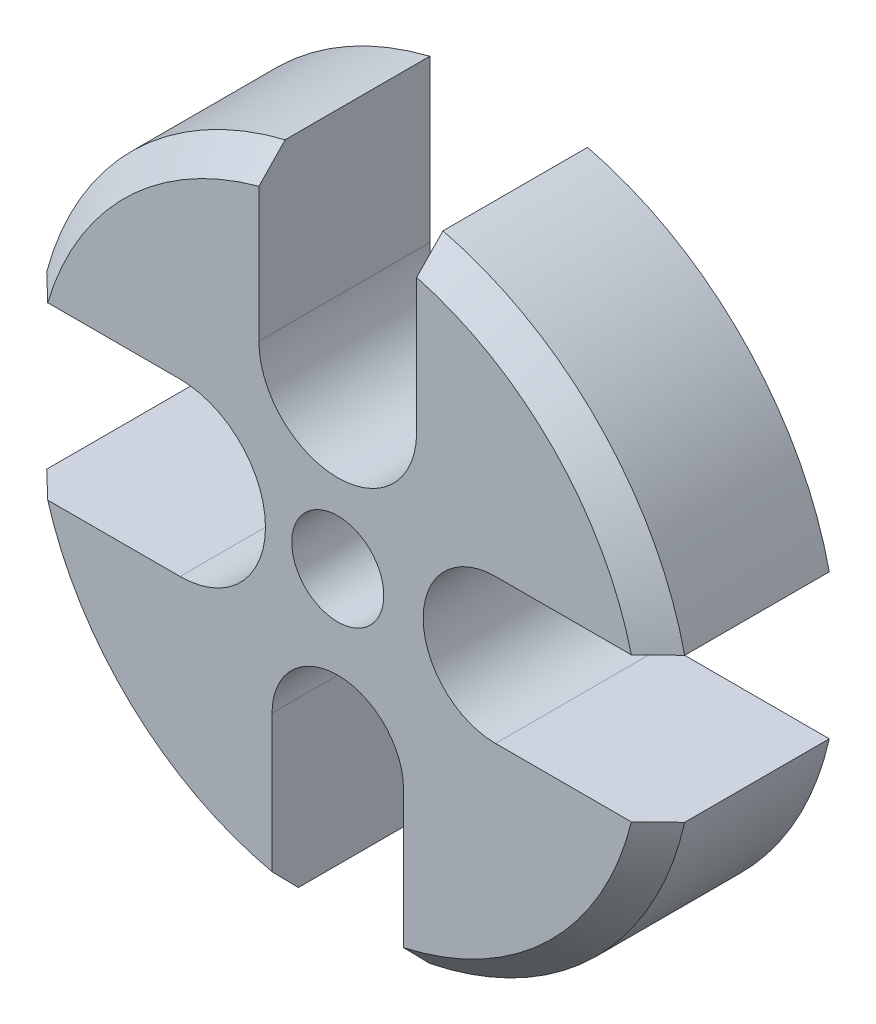
ISO-10303-21;
HEADER;
FILE_DESCRIPTION(('STEP AP214'),'2;1');
FILE_NAME('part.step','',(''),(''),'','','');
FILE_SCHEMA(('AUTOMOTIVE_DESIGN { 1 0 10303 214 1 1 1 1 }'));
ENDSEC;
DATA;
#1=APPLICATION_CONTEXT('core data for automotive mechanical design processes');
#2=APPLICATION_PROTOCOL_DEFINITION('international standard','automotive_design',2000,#1);
#3=PRODUCT_CONTEXT('',#1,'mechanical');
#4=PRODUCT('Part','Part','',(#3));
#5=PRODUCT_RELATED_PRODUCT_CATEGORY('part','',(#4));
#6=PRODUCT_DEFINITION_FORMATION('','',#4);
#7=PRODUCT_DEFINITION_CONTEXT('part definition',#1,'design');
#8=PRODUCT_DEFINITION('design','',#6,#7);
#9=PRODUCT_DEFINITION_SHAPE('','',#8);
#10=(LENGTH_UNIT() NAMED_UNIT(*) SI_UNIT(.MILLI.,.METRE.));
#11=(NAMED_UNIT(*) PLANE_ANGLE_UNIT() SI_UNIT($,.RADIAN.));
#12=(NAMED_UNIT(*) SI_UNIT($,.STERADIAN.) SOLID_ANGLE_UNIT());
#13=UNCERTAINTY_MEASURE_WITH_UNIT(LENGTH_MEASURE(1.E-05),#10,'distance_accuracy_value','');
#14=(GEOMETRIC_REPRESENTATION_CONTEXT(3) GLOBAL_UNCERTAINTY_ASSIGNED_CONTEXT((#13)) GLOBAL_UNIT_ASSIGNED_CONTEXT((#10,
#11,#12)) REPRESENTATION_CONTEXT('',''));
#15=CARTESIAN_POINT('',(0.,0.,0.));
#16=DIRECTION('',(0.,0.,1.));
#17=DIRECTION('',(1.,0.,0.));
#18=AXIS2_PLACEMENT_3D('',#15,#16,#17);
#19=CARTESIAN_POINT('',(5.,0.,13.));
#20=DIRECTION('',(1.,0.,0.));
#21=DIRECTION('',(0.,0.,-1.));
#22=AXIS2_PLACEMENT_3D('',#19,#20,#21);
#23=PLANE('',#22);
#24=DIRECTION('',(0.,0.,-1.));
#25=VECTOR('',#24,1.);
#26=CARTESIAN_POINT('',(5.,-24.4948974278318,13.));
#27=LINE('',#26,#25);
#28=CARTESIAN_POINT('',(5.,-24.4948974278318,11.));
#29=VERTEX_POINT('',#28);
#30=CARTESIAN_POINT('',(5.,-24.4948974278318,0.));
#31=VERTEX_POINT('',#30);
#32=EDGE_CURVE('E313',#29,#31,#27,.T.);
#33=ORIENTED_EDGE('',*,*,#32,.F.);
#34=CARTESIAN_POINT('',(5.,-24.4948974278318,11.));
#35=CARTESIAN_POINT('',(5.,-24.1543875179738,11.3336560287532));
#36=CARTESIAN_POINT('',(5.,-23.8137198057054,11.6671507082415));
#37=CARTESIAN_POINT('',(5.,-23.1320687699819,12.3338173749142));
#38=CARTESIAN_POINT('',(5.,-22.791085446521,12.6669893620925));
#39=CARTESIAN_POINT('',(5.,-22.4499443206437,13.));
#40=B_SPLINE_CURVE_WITH_KNOTS('',3,(#34,#35,#36,#37,#38,#39),.UNSPECIFIED.,.F.,.F.,(4,2,4),(0.,
1.43019534430208,2.86039071531582),.UNSPECIFIED.);
#41=CARTESIAN_POINT('',(5.,-22.4499443206437,13.));
#42=VERTEX_POINT('',#41);
#43=EDGE_CURVE('E420',#29,#42,#40,.T.);
#44=ORIENTED_EDGE('',*,*,#43,.T.);
#45=DIRECTION('',(0.,-1.,0.));
#46=VECTOR('',#45,1.);
#47=CARTESIAN_POINT('',(5.,0.,13.));
#48=LINE('',#47,#46);
#49=CARTESIAN_POINT('',(5.,-12.,13.));
#50=VERTEX_POINT('',#49);
#51=EDGE_CURVE('E194',#50,#42,#48,.T.);
#52=ORIENTED_EDGE('',*,*,#51,.F.);
#53=DIRECTION('',(0.,0.,-1.));
#54=VECTOR('',#53,1.);
#55=CARTESIAN_POINT('',(5.,-12.,13.));
#56=LINE('',#55,#54);
#57=CARTESIAN_POINT('',(5.,-12.,0.));
#58=VERTEX_POINT('',#57);
#59=EDGE_CURVE('E237',#50,#58,#56,.T.);
#60=ORIENTED_EDGE('',*,*,#59,.T.);
#61=DIRECTION('',(0.,-1.,0.));
#62=VECTOR('',#61,1.);
#63=CARTESIAN_POINT('',(5.,0.,0.));
#64=LINE('',#63,#62);
#65=EDGE_CURVE('E238',#58,#31,#64,.T.);
#66=ORIENTED_EDGE('',*,*,#65,.T.);
#67=EDGE_LOOP('',(#33,#44,#52,#60,#66));
#68=FACE_BOUND('',#67,.T.);
#69=ADVANCED_FACE('F41',(#68),#23,.F.);
#70=CARTESIAN_POINT('',(0.,0.,13.));
#71=DIRECTION('',(0.,0.,-1.));
#72=DIRECTION('',(-1.,0.,0.));
#73=AXIS2_PLACEMENT_3D('',#70,#71,#72);
#74=CYLINDRICAL_SURFACE('',#73,25.);
#75=DIRECTION('',(0.,0.,-1.));
#76=VECTOR('',#75,1.);
#77=CARTESIAN_POINT('',(24.3874967965144,-5.5,13.));
#78=LINE('',#77,#76);
#79=CARTESIAN_POINT('',(24.3874967965144,-5.5,11.));
#80=VERTEX_POINT('',#79);
#81=CARTESIAN_POINT('',(24.3874967965144,-5.5,0.));
#82=VERTEX_POINT('',#81);
#83=EDGE_CURVE('E202',#80,#82,#78,.T.);
#84=ORIENTED_EDGE('',*,*,#83,.F.);
#85=CARTESIAN_POINT('',(0.,0.,11.));
#86=DIRECTION('',(0.,0.,1.));
#87=DIRECTION('',(1.,0.,0.));
#88=AXIS2_PLACEMENT_3D('',#85,#86,#87);
#89=CIRCLE('',#88,25.);
#90=EDGE_CURVE('E403',#80,#29,#89,.F.);
#91=ORIENTED_EDGE('',*,*,#90,.T.);
#92=ORIENTED_EDGE('',*,*,#32,.T.);
#93=CARTESIAN_POINT('',(0.,0.,0.));
#94=DIRECTION('',(0.,0.,1.));
#95=DIRECTION('',(1.,0.,0.));
#96=AXIS2_PLACEMENT_3D('',#93,#94,#95);
#97=CIRCLE('',#96,25.);
#98=EDGE_CURVE('E245',#31,#82,#97,.T.);
#99=ORIENTED_EDGE('',*,*,#98,.T.);
#100=EDGE_LOOP('',(#84,#91,#92,#99));
#101=FACE_BOUND('',#100,.T.);
#102=ADVANCED_FACE('F413',(#101),#74,.T.);
#103=CARTESIAN_POINT('',(0.,-5.5,13.));
#104=DIRECTION('',(0.,-1.,0.));
#105=DIRECTION('',(0.,0.,-1.));
#106=AXIS2_PLACEMENT_3D('',#103,#104,#105);
#107=PLANE('',#106);
#108=DIRECTION('',(-1.,0.,0.));
#109=VECTOR('',#108,1.);
#110=CARTESIAN_POINT('',(0.,-5.5,13.));
#111=LINE('',#110,#109);
#112=CARTESIAN_POINT('',(22.3327114341273,-5.5,13.));
#113=VERTEX_POINT('',#112);
#114=CARTESIAN_POINT('',(12.,-5.5,13.));
#115=VERTEX_POINT('',#114);
#116=EDGE_CURVE('E184',#113,#115,#111,.T.);
#117=ORIENTED_EDGE('',*,*,#116,.F.);
#118=CARTESIAN_POINT('',(22.3327114341273,-5.5,13.));
#119=CARTESIAN_POINT('',(22.6755611901675,-5.5,12.6670627467669));
#120=CARTESIAN_POINT('',(23.0182181841032,-5.5,12.3339274511585));
#121=CARTESIAN_POINT('',(23.7031466382215,-5.5,11.6672607844808));
#122=CARTESIAN_POINT('',(24.0454180984148,-5.5,11.3337294134226));
#123=CARTESIAN_POINT('',(24.3874967965144,-5.5,11.));
#124=B_SPLINE_CURVE_WITH_KNOTS('',3,(#118,#119,#120,#121,#122,#123),.UNSPECIFIED.,.F.,.F.,(4,2,
4),(0.,1.43371422049806,2.86742840103957),.UNSPECIFIED.);
#125=EDGE_CURVE('E398',#113,#80,#124,.T.);
#126=ORIENTED_EDGE('',*,*,#125,.T.);
#127=ORIENTED_EDGE('',*,*,#83,.T.);
#128=DIRECTION('',(-1.,0.,0.));
#129=VECTOR('',#128,1.);
#130=CARTESIAN_POINT('',(0.,-5.5,0.));
#131=LINE('',#130,#129);
#132=CARTESIAN_POINT('',(12.,-5.5,0.));
#133=VERTEX_POINT('',#132);
#134=EDGE_CURVE('E203',#82,#133,#131,.T.);
#135=ORIENTED_EDGE('',*,*,#134,.T.);
#136=DIRECTION('',(0.,0.,-1.));
#137=VECTOR('',#136,1.);
#138=CARTESIAN_POINT('',(12.,-5.5,13.));
#139=LINE('',#138,#137);
#140=EDGE_CURVE('E196',#115,#133,#139,.T.);
#141=ORIENTED_EDGE('',*,*,#140,.F.);
#142=EDGE_LOOP('',(#117,#126,#127,#135,#141));
#143=FACE_BOUND('',#142,.T.);
#144=ADVANCED_FACE('F200',(#143),#107,.F.);
#145=CARTESIAN_POINT('',(12.,0.,13.));
#146=DIRECTION('',(0.,0.,-1.));
#147=DIRECTION('',(-1.,0.,0.));
#148=AXIS2_PLACEMENT_3D('',#145,#146,#147);
#149=CYLINDRICAL_SURFACE('',#148,5.5);
#150=CARTESIAN_POINT('',(12.,0.,0.));
#151=DIRECTION('',(0.,0.,1.));
#152=DIRECTION('',(1.,0.,0.));
#153=AXIS2_PLACEMENT_3D('',#150,#151,#152);
#154=CIRCLE('',#153,5.5);
#155=CARTESIAN_POINT('',(12.,5.5,0.));
#156=VERTEX_POINT('',#155);
#157=EDGE_CURVE('E250',#156,#133,#154,.T.);
#158=ORIENTED_EDGE('',*,*,#157,.F.);
#159=DIRECTION('',(0.,0.,-1.));
#160=VECTOR('',#159,1.);
#161=CARTESIAN_POINT('',(12.,5.5,13.));
#162=LINE('',#161,#160);
#163=CARTESIAN_POINT('',(12.,5.5,13.));
#164=VERTEX_POINT('',#163);
#165=EDGE_CURVE('E206',#164,#156,#162,.T.);
#166=ORIENTED_EDGE('',*,*,#165,.F.);
#167=CARTESIAN_POINT('',(12.,0.,13.));
#168=DIRECTION('',(0.,0.,1.));
#169=DIRECTION('',(1.,0.,0.));
#170=AXIS2_PLACEMENT_3D('',#167,#168,#169);
#171=CIRCLE('',#170,5.5);
#172=EDGE_CURVE('E187',#164,#115,#171,.T.);
#173=ORIENTED_EDGE('',*,*,#172,.T.);
#174=ORIENTED_EDGE('',*,*,#140,.T.);
#175=EDGE_LOOP('',(#158,#166,#173,#174));
#176=FACE_BOUND('',#175,.T.);
#177=ADVANCED_FACE('F207',(#176),#149,.F.);
#178=CARTESIAN_POINT('',(0.,5.5,13.));
#179=DIRECTION('',(0.,-1.,0.));
#180=DIRECTION('',(0.,0.,-1.));
#181=AXIS2_PLACEMENT_3D('',#178,#179,#180);
#182=PLANE('',#181);
#183=DIRECTION('',(0.,0.,-1.));
#184=VECTOR('',#183,1.);
#185=CARTESIAN_POINT('',(24.3874967965144,5.5,13.));
#186=LINE('',#185,#184);
#187=CARTESIAN_POINT('',(24.3874967965144,5.5,11.));
#188=VERTEX_POINT('',#187);
#189=CARTESIAN_POINT('',(24.3874967965144,5.5,0.));
#190=VERTEX_POINT('',#189);
#191=EDGE_CURVE('E307',#188,#190,#186,.T.);
#192=ORIENTED_EDGE('',*,*,#191,.F.);
#193=CARTESIAN_POINT('',(24.3874967965144,5.5,11.));
#194=CARTESIAN_POINT('',(24.0454180984148,5.5,11.3337294134226));
#195=CARTESIAN_POINT('',(23.7031466382214,5.5,11.6672607844808));
#196=CARTESIAN_POINT('',(23.0182181841032,5.5,12.3339274511585));
#197=CARTESIAN_POINT('',(22.6755611901675,5.5,12.6670627467669));
#198=CARTESIAN_POINT('',(22.3327114341273,5.5,13.));
#199=B_SPLINE_CURVE_WITH_KNOTS('',3,(#193,#194,#195,#196,#197,#198),.UNSPECIFIED.,.F.,.F.,(4,2,
4),(0.,1.43371418054151,2.86742840103957),.UNSPECIFIED.);
#200=CARTESIAN_POINT('',(22.3327114341273,5.5,13.));
#201=VERTEX_POINT('',#200);
#202=EDGE_CURVE('E391',#188,#201,#199,.T.);
#203=ORIENTED_EDGE('',*,*,#202,.T.);
#204=DIRECTION('',(-1.,0.,0.));
#205=VECTOR('',#204,1.);
#206=CARTESIAN_POINT('',(0.,5.5,13.));
#207=LINE('',#206,#205);
#208=EDGE_CURVE('E209',#201,#164,#207,.T.);
#209=ORIENTED_EDGE('',*,*,#208,.T.);
#210=ORIENTED_EDGE('',*,*,#165,.T.);
#211=DIRECTION('',(-1.,0.,0.));
#212=VECTOR('',#211,1.);
#213=CARTESIAN_POINT('',(0.,5.5,0.));
#214=LINE('',#213,#212);
#215=EDGE_CURVE('E247',#190,#156,#214,.T.);
#216=ORIENTED_EDGE('',*,*,#215,.F.);
#217=EDGE_LOOP('',(#192,#203,#209,#210,#216));
#218=FACE_BOUND('',#217,.T.);
#219=ADVANCED_FACE('F383',(#218),#182,.T.);
#220=CARTESIAN_POINT('',(0.,0.,13.));
#221=DIRECTION('',(0.,0.,-1.));
#222=DIRECTION('',(-1.,0.,0.));
#223=AXIS2_PLACEMENT_3D('',#220,#221,#222);
#224=CYLINDRICAL_SURFACE('',#223,25.);
#225=DIRECTION('',(0.,0.,-1.));
#226=VECTOR('',#225,1.);
#227=CARTESIAN_POINT('',(6.,24.2693221990232,13.));
#228=LINE('',#227,#226);
#229=CARTESIAN_POINT('',(6.,24.2693221990232,11.));
#230=VERTEX_POINT('',#229);
#231=CARTESIAN_POINT('',(6.,24.2693221990232,0.));
#232=VERTEX_POINT('',#231);
#233=EDGE_CURVE('E304',#230,#232,#228,.T.);
#234=ORIENTED_EDGE('',*,*,#233,.F.);
#235=CARTESIAN_POINT('',(0.,0.,11.));
#236=DIRECTION('',(0.,0.,1.));
#237=DIRECTION('',(1.,0.,0.));
#238=AXIS2_PLACEMENT_3D('',#235,#236,#237);
#239=CIRCLE('',#238,25.);
#240=EDGE_CURVE('E397',#230,#188,#239,.F.);
#241=ORIENTED_EDGE('',*,*,#240,.T.);
#242=ORIENTED_EDGE('',*,*,#191,.T.);
#243=CARTESIAN_POINT('',(0.,0.,0.));
#244=DIRECTION('',(0.,0.,1.));
#245=DIRECTION('',(1.,0.,0.));
#246=AXIS2_PLACEMENT_3D('',#243,#244,#245);
#247=CIRCLE('',#246,25.);
#248=EDGE_CURVE('E252',#190,#232,#247,.T.);
#249=ORIENTED_EDGE('',*,*,#248,.T.);
#250=EDGE_LOOP('',(#234,#241,#242,#249));
#251=FACE_BOUND('',#250,.T.);
#252=ADVANCED_FACE('F379',(#251),#224,.T.);
#253=CARTESIAN_POINT('',(6.,0.,13.));
#254=DIRECTION('',(1.,0.,0.));
#255=DIRECTION('',(0.,0.,-1.));
#256=AXIS2_PLACEMENT_3D('',#253,#254,#255);
#257=PLANE('',#256);
#258=DIRECTION('',(0.,-1.,0.));
#259=VECTOR('',#258,1.);
#260=CARTESIAN_POINT('',(6.,0.,13.));
#261=LINE('',#260,#259);
#262=CARTESIAN_POINT('',(6.,22.2036033111745,13.));
#263=VERTEX_POINT('',#262);
#264=CARTESIAN_POINT('',(6.,12.,13.));
#265=VERTEX_POINT('',#264);
#266=EDGE_CURVE('E215',#263,#265,#261,.T.);
#267=ORIENTED_EDGE('',*,*,#266,.F.);
#268=CARTESIAN_POINT('',(6.,22.2036033111745,13.));
#269=CARTESIAN_POINT('',(6.,22.5483534369044,12.6671455323017));
#270=CARTESIAN_POINT('',(6.,22.892871743888,12.3340516284222));
#271=CARTESIAN_POINT('',(6.,23.5814447064855,11.6673849617362));
#272=CARTESIAN_POINT('',(6.,23.9254993621181,11.3338121989491));
#273=CARTESIAN_POINT('',(6.,24.2693221990232,11.));
#274=B_SPLINE_CURVE_WITH_KNOTS('',3,(#268,#269,#270,#271,#272,#273),.UNSPECIFIED.,.F.,.F.,(4,2,
4),(0.,1.43763685047273,2.87527364299825),.UNSPECIFIED.);
#275=EDGE_CURVE('E359',#263,#230,#274,.T.);
#276=ORIENTED_EDGE('',*,*,#275,.T.);
#277=ORIENTED_EDGE('',*,*,#233,.T.);
#278=DIRECTION('',(0.,-1.,0.));
#279=VECTOR('',#278,1.);
#280=CARTESIAN_POINT('',(6.,0.,0.));
#281=LINE('',#280,#279);
#282=CARTESIAN_POINT('',(6.,12.,0.));
#283=VERTEX_POINT('',#282);
#284=EDGE_CURVE('E254',#232,#283,#281,.T.);
#285=ORIENTED_EDGE('',*,*,#284,.T.);
#286=DIRECTION('',(0.,0.,-1.));
#287=VECTOR('',#286,1.);
#288=CARTESIAN_POINT('',(6.,12.,13.));
#289=LINE('',#288,#287);
#290=EDGE_CURVE('E303',#265,#283,#289,.T.);
#291=ORIENTED_EDGE('',*,*,#290,.F.);
#292=EDGE_LOOP('',(#267,#276,#277,#285,#291));
#293=FACE_BOUND('',#292,.T.);
#294=ADVANCED_FACE('F374',(#293),#257,.F.);
#295=CARTESIAN_POINT('',(0.,12.,13.));
#296=DIRECTION('',(0.,0.,-1.));
#297=DIRECTION('',(-1.,0.,0.));
#298=AXIS2_PLACEMENT_3D('',#295,#296,#297);
#299=CYLINDRICAL_SURFACE('',#298,6.);
#300=CARTESIAN_POINT('',(0.,12.,0.));
#301=DIRECTION('',(0.,0.,1.));
#302=DIRECTION('',(1.,0.,0.));
#303=AXIS2_PLACEMENT_3D('',#300,#301,#302);
#304=CIRCLE('',#303,6.);
#305=CARTESIAN_POINT('',(-6.,12.,0.));
#306=VERTEX_POINT('',#305);
#307=EDGE_CURVE('E256',#306,#283,#304,.T.);
#308=ORIENTED_EDGE('',*,*,#307,.F.);
#309=DIRECTION('',(0.,0.,-1.));
#310=VECTOR('',#309,1.);
#311=CARTESIAN_POINT('',(-6.,12.,13.));
#312=LINE('',#311,#310);
#313=CARTESIAN_POINT('',(-6.,12.,13.));
#314=VERTEX_POINT('',#313);
#315=EDGE_CURVE('E301',#314,#306,#312,.T.);
#316=ORIENTED_EDGE('',*,*,#315,.F.);
#317=CARTESIAN_POINT('',(0.,12.,13.));
#318=DIRECTION('',(0.,0.,1.));
#319=DIRECTION('',(1.,0.,0.));
#320=AXIS2_PLACEMENT_3D('',#317,#318,#319);
#321=CIRCLE('',#320,6.);
#322=EDGE_CURVE('E220',#314,#265,#321,.T.);
#323=ORIENTED_EDGE('',*,*,#322,.T.);
#324=ORIENTED_EDGE('',*,*,#290,.T.);
#325=EDGE_LOOP('',(#308,#316,#323,#324));
#326=FACE_BOUND('',#325,.T.);
#327=ADVANCED_FACE('F375',(#326),#299,.F.);
#328=CARTESIAN_POINT('',(-6.,0.,13.));
#329=DIRECTION('',(1.,0.,0.));
#330=DIRECTION('',(0.,0.,-1.));
#331=AXIS2_PLACEMENT_3D('',#328,#329,#330);
#332=PLANE('',#331);
#333=DIRECTION('',(0.,0.,-1.));
#334=VECTOR('',#333,1.);
#335=CARTESIAN_POINT('',(-6.,24.2693221990232,13.));
#336=LINE('',#335,#334);
#337=CARTESIAN_POINT('',(-6.,24.2693221990232,11.));
#338=VERTEX_POINT('',#337);
#339=CARTESIAN_POINT('',(-6.,24.2693221990232,0.));
#340=VERTEX_POINT('',#339);
#341=EDGE_CURVE('E298',#338,#340,#336,.T.);
#342=ORIENTED_EDGE('',*,*,#341,.F.);
#343=CARTESIAN_POINT('',(-6.,24.2693221990232,11.));
#344=CARTESIAN_POINT('',(-6.,23.9254993621181,11.3338121989491));
#345=CARTESIAN_POINT('',(-6.,23.5814447064855,11.6673849617362));
#346=CARTESIAN_POINT('',(-6.,22.892871743888,12.3340516284222));
#347=CARTESIAN_POINT('',(-6.,22.5483534369044,12.6671455323017));
#348=CARTESIAN_POINT('',(-6.,22.2036033111746,13.));
#349=B_SPLINE_CURVE_WITH_KNOTS('',3,(#343,#344,#345,#346,#347,#348),.UNSPECIFIED.,.F.,.F.,(4,2,
4),(0.,1.43763679252552,2.87527364299824),.UNSPECIFIED.);
#350=CARTESIAN_POINT('',(-6.,22.2036033111746,13.));
#351=VERTEX_POINT('',#350);
#352=EDGE_CURVE('E355',#338,#351,#349,.T.);
#353=ORIENTED_EDGE('',*,*,#352,.T.);
#354=DIRECTION('',(0.,-1.,0.));
#355=VECTOR('',#354,1.);
#356=CARTESIAN_POINT('',(-6.,0.,13.));
#357=LINE('',#356,#355);
#358=EDGE_CURVE('E219',#351,#314,#357,.T.);
#359=ORIENTED_EDGE('',*,*,#358,.T.);
#360=ORIENTED_EDGE('',*,*,#315,.T.);
#361=DIRECTION('',(0.,-1.,0.));
#362=VECTOR('',#361,1.);
#363=CARTESIAN_POINT('',(-6.,0.,0.));
#364=LINE('',#363,#362);
#365=EDGE_CURVE('E261',#340,#306,#364,.T.);
#366=ORIENTED_EDGE('',*,*,#365,.F.);
#367=EDGE_LOOP('',(#342,#353,#359,#360,#366));
#368=FACE_BOUND('',#367,.T.);
#369=ADVANCED_FACE('F370',(#368),#332,.T.);
#370=CARTESIAN_POINT('',(0.,0.,13.));
#371=DIRECTION('',(0.,0.,-1.));
#372=DIRECTION('',(-1.,0.,0.));
#373=AXIS2_PLACEMENT_3D('',#370,#371,#372);
#374=CYLINDRICAL_SURFACE('',#373,25.);
#375=DIRECTION('',(0.,0.,-1.));
#376=VECTOR('',#375,1.);
#377=CARTESIAN_POINT('',(-24.1402154091466,6.5,13.));
#378=LINE('',#377,#376);
#379=CARTESIAN_POINT('',(-24.1402154091466,6.5,11.));
#380=VERTEX_POINT('',#379);
#381=CARTESIAN_POINT('',(-24.1402154091466,6.5,0.));
#382=VERTEX_POINT('',#381);
#383=EDGE_CURVE('E296',#380,#382,#378,.T.);
#384=ORIENTED_EDGE('',*,*,#383,.F.);
#385=CARTESIAN_POINT('',(0.,0.,11.));
#386=DIRECTION('',(0.,0.,1.));
#387=DIRECTION('',(1.,0.,0.));
#388=AXIS2_PLACEMENT_3D('',#385,#386,#387);
#389=CIRCLE('',#388,25.);
#390=EDGE_CURVE('E332',#380,#338,#389,.F.);
#391=ORIENTED_EDGE('',*,*,#390,.T.);
#392=ORIENTED_EDGE('',*,*,#341,.T.);
#393=CARTESIAN_POINT('',(0.,0.,0.));
#394=DIRECTION('',(0.,0.,1.));
#395=DIRECTION('',(1.,0.,0.));
#396=AXIS2_PLACEMENT_3D('',#393,#394,#395);
#397=CIRCLE('',#396,25.);
#398=EDGE_CURVE('E262',#340,#382,#397,.T.);
#399=ORIENTED_EDGE('',*,*,#398,.T.);
#400=EDGE_LOOP('',(#384,#391,#392,#399));
#401=FACE_BOUND('',#400,.T.);
#402=ADVANCED_FACE('F371',(#401),#374,.T.);
#403=CARTESIAN_POINT('',(0.,6.5,13.));
#404=DIRECTION('',(0.,-1.,0.));
#405=DIRECTION('',(0.,0.,-1.));
#406=AXIS2_PLACEMENT_3D('',#403,#404,#405);
#407=PLANE('',#406);
#408=DIRECTION('',(-1.,0.,0.));
#409=VECTOR('',#408,1.);
#410=CARTESIAN_POINT('',(0.,6.5,13.));
#411=LINE('',#410,#409);
#412=CARTESIAN_POINT('',(-12.,6.5,13.));
#413=VERTEX_POINT('',#412);
#414=CARTESIAN_POINT('',(-22.0624114729102,6.5,13.));
#415=VERTEX_POINT('',#414);
#416=EDGE_CURVE('E225',#413,#415,#411,.T.);
#417=ORIENTED_EDGE('',*,*,#416,.T.);
#418=CARTESIAN_POINT('',(-22.0624114729102,6.5,13.));
#419=CARTESIAN_POINT('',(-22.4092625532097,6.5,12.6672384838267));
#420=CARTESIAN_POINT('',(-22.7558384262895,6.5,12.3341910543312));
#421=CARTESIAN_POINT('',(-23.448439738337,6.5,11.6675243876321));
#422=CARTESIAN_POINT('',(-23.794465177336,6.5,11.3339051504609));
#423=CARTESIAN_POINT('',(-24.1402154091466,6.5,11.));
#424=B_SPLINE_CURVE_WITH_KNOTS('',3,(#418,#419,#420,#421,#422,#423),.UNSPECIFIED.,.F.,.F.,(4,2,
4),(0.,1.44198433932232,2.88396859672822),.UNSPECIFIED.);
#425=EDGE_CURVE('E323',#415,#380,#424,.T.);
#426=ORIENTED_EDGE('',*,*,#425,.T.);
#427=ORIENTED_EDGE('',*,*,#383,.T.);
#428=DIRECTION('',(-1.,0.,0.));
#429=VECTOR('',#428,1.);
#430=CARTESIAN_POINT('',(0.,6.5,0.));
#431=LINE('',#430,#429);
#432=CARTESIAN_POINT('',(-12.,6.5,0.));
#433=VERTEX_POINT('',#432);
#434=EDGE_CURVE('E270',#433,#382,#431,.T.);
#435=ORIENTED_EDGE('',*,*,#434,.F.);
#436=DIRECTION('',(0.,0.,-1.));
#437=VECTOR('',#436,1.);
#438=CARTESIAN_POINT('',(-12.,6.5,13.));
#439=LINE('',#438,#437);
#440=EDGE_CURVE('E293',#413,#433,#439,.T.);
#441=ORIENTED_EDGE('',*,*,#440,.F.);
#442=EDGE_LOOP('',(#417,#426,#427,#435,#441));
#443=FACE_BOUND('',#442,.T.);
#444=ADVANCED_FACE('F334',(#443),#407,.T.);
#445=CARTESIAN_POINT('',(-12.,0.,13.));
#446=DIRECTION('',(0.,0.,-1.));
#447=DIRECTION('',(-1.,0.,0.));
#448=AXIS2_PLACEMENT_3D('',#445,#446,#447);
#449=CYLINDRICAL_SURFACE('',#448,6.5);
#450=CARTESIAN_POINT('',(-12.,0.,0.));
#451=DIRECTION('',(0.,0.,1.));
#452=DIRECTION('',(1.,0.,0.));
#453=AXIS2_PLACEMENT_3D('',#450,#451,#452);
#454=CIRCLE('',#453,6.5);
#455=CARTESIAN_POINT('',(-12.,-6.5,0.));
#456=VERTEX_POINT('',#455);
#457=EDGE_CURVE('E269',#456,#433,#454,.T.);
#458=ORIENTED_EDGE('',*,*,#457,.F.);
#459=DIRECTION('',(0.,0.,-1.));
#460=VECTOR('',#459,1.);
#461=CARTESIAN_POINT('',(-12.,-6.5,13.));
#462=LINE('',#461,#460);
#463=CARTESIAN_POINT('',(-12.,-6.5,13.));
#464=VERTEX_POINT('',#463);
#465=EDGE_CURVE('E291',#464,#456,#462,.T.);
#466=ORIENTED_EDGE('',*,*,#465,.F.);
#467=CARTESIAN_POINT('',(-12.,0.,13.));
#468=DIRECTION('',(0.,0.,1.));
#469=DIRECTION('',(1.,0.,0.));
#470=AXIS2_PLACEMENT_3D('',#467,#468,#469);
#471=CIRCLE('',#470,6.5);
#472=EDGE_CURVE('E223',#464,#413,#471,.T.);
#473=ORIENTED_EDGE('',*,*,#472,.T.);
#474=ORIENTED_EDGE('',*,*,#440,.T.);
#475=EDGE_LOOP('',(#458,#466,#473,#474));
#476=FACE_BOUND('',#475,.T.);
#477=ADVANCED_FACE('F445',(#476),#449,.F.);
#478=CARTESIAN_POINT('',(0.,-6.5,13.));
#479=DIRECTION('',(0.,-1.,0.));
#480=DIRECTION('',(0.,0.,-1.));
#481=AXIS2_PLACEMENT_3D('',#478,#479,#480);
#482=PLANE('',#481);
#483=DIRECTION('',(0.,0.,-1.));
#484=VECTOR('',#483,1.);
#485=CARTESIAN_POINT('',(-24.1402154091466,-6.5,13.));
#486=LINE('',#485,#484);
#487=CARTESIAN_POINT('',(-24.1402154091466,-6.5,11.));
#488=VERTEX_POINT('',#487);
#489=CARTESIAN_POINT('',(-24.1402154091466,-6.5,0.));
#490=VERTEX_POINT('',#489);
#491=EDGE_CURVE('E292',#488,#490,#486,.T.);
#492=ORIENTED_EDGE('',*,*,#491,.F.);
#493=CARTESIAN_POINT('',(-24.1402154091466,-6.5,11.));
#494=CARTESIAN_POINT('',(-23.794465177336,-6.5,11.3339051504609));
#495=CARTESIAN_POINT('',(-23.448439738337,-6.5,11.6675243876321));
#496=CARTESIAN_POINT('',(-22.7558384262895,-6.5,12.3341910543312));
#497=CARTESIAN_POINT('',(-22.4092625532097,-6.5,12.6672384838267));
#498=CARTESIAN_POINT('',(-22.0624114729102,-6.5,13.));
#499=B_SPLINE_CURVE_WITH_KNOTS('',3,(#493,#494,#495,#496,#497,#498),.UNSPECIFIED.,.F.,.F.,(4,2,
4),(0.,1.4419842574059,2.88396859672822),.UNSPECIFIED.);
#500=CARTESIAN_POINT('',(-22.0624114729102,-6.5,13.));
#501=VERTEX_POINT('',#500);
#502=EDGE_CURVE('E11',#488,#501,#499,.T.);
#503=ORIENTED_EDGE('',*,*,#502,.T.);
#504=DIRECTION('',(-1.,0.,0.));
#505=VECTOR('',#504,1.);
#506=CARTESIAN_POINT('',(0.,-6.5,13.));
#507=LINE('',#506,#505);
#508=EDGE_CURVE('E230',#464,#501,#507,.T.);
#509=ORIENTED_EDGE('',*,*,#508,.F.);
#510=ORIENTED_EDGE('',*,*,#465,.T.);
#511=DIRECTION('',(-1.,0.,0.));
#512=VECTOR('',#511,1.);
#513=CARTESIAN_POINT('',(0.,-6.5,0.));
#514=LINE('',#513,#512);
#515=EDGE_CURVE('E272',#456,#490,#514,.T.);
#516=ORIENTED_EDGE('',*,*,#515,.T.);
#517=EDGE_LOOP('',(#492,#503,#509,#510,#516));
#518=FACE_BOUND('',#517,.T.);
#519=ADVANCED_FACE('F438',(#518),#482,.F.);
#520=CARTESIAN_POINT('',(0.,0.,13.));
#521=DIRECTION('',(0.,0.,-1.));
#522=DIRECTION('',(-1.,0.,0.));
#523=AXIS2_PLACEMENT_3D('',#520,#521,#522);
#524=CYLINDRICAL_SURFACE('',#523,25.);
#525=DIRECTION('',(0.,0.,-1.));
#526=VECTOR('',#525,1.);
#527=CARTESIAN_POINT('',(-5.,-24.4948974278318,13.));
#528=LINE('',#527,#526);
#529=CARTESIAN_POINT('',(-5.,-24.4948974278318,11.));
#530=VERTEX_POINT('',#529);
#531=CARTESIAN_POINT('',(-5.,-24.4948974278318,0.));
#532=VERTEX_POINT('',#531);
#533=EDGE_CURVE('E287',#530,#532,#528,.T.);
#534=ORIENTED_EDGE('',*,*,#533,.F.);
#535=CARTESIAN_POINT('',(0.,0.,11.));
#536=DIRECTION('',(0.,0.,1.));
#537=DIRECTION('',(1.,0.,0.));
#538=AXIS2_PLACEMENT_3D('',#535,#536,#537);
#539=CIRCLE('',#538,25.);
#540=EDGE_CURVE('E57',#530,#488,#539,.F.);
#541=ORIENTED_EDGE('',*,*,#540,.T.);
#542=ORIENTED_EDGE('',*,*,#491,.T.);
#543=CARTESIAN_POINT('',(0.,0.,0.));
#544=DIRECTION('',(0.,0.,1.));
#545=DIRECTION('',(1.,0.,0.));
#546=AXIS2_PLACEMENT_3D('',#543,#544,#545);
#547=CIRCLE('',#546,25.);
#548=EDGE_CURVE('E277',#490,#532,#547,.T.);
#549=ORIENTED_EDGE('',*,*,#548,.T.);
#550=EDGE_LOOP('',(#534,#541,#542,#549));
#551=FACE_BOUND('',#550,.T.);
#552=ADVANCED_FACE('F434',(#551),#524,.T.);
#553=CARTESIAN_POINT('',(-5.,0.,13.));
#554=DIRECTION('',(1.,0.,0.));
#555=DIRECTION('',(0.,0.,-1.));
#556=AXIS2_PLACEMENT_3D('',#553,#554,#555);
#557=PLANE('',#556);
#558=DIRECTION('',(0.,-1.,0.));
#559=VECTOR('',#558,1.);
#560=CARTESIAN_POINT('',(-5.,0.,13.));
#561=LINE('',#560,#559);
#562=CARTESIAN_POINT('',(-5.,-12.,13.));
#563=VERTEX_POINT('',#562);
#564=CARTESIAN_POINT('',(-5.,-22.4499443206437,13.));
#565=VERTEX_POINT('',#564);
#566=EDGE_CURVE('E231',#563,#565,#561,.T.);
#567=ORIENTED_EDGE('',*,*,#566,.T.);
#568=CARTESIAN_POINT('',(-5.,-22.4499443206437,13.));
#569=CARTESIAN_POINT('',(-5.,-22.791085446521,12.6669893620925));
#570=CARTESIAN_POINT('',(-5.,-23.1320687699819,12.3338173749142));
#571=CARTESIAN_POINT('',(-5.,-23.8137198057054,11.6671507082415));
#572=CARTESIAN_POINT('',(-5.,-24.1543875179738,11.3336560287532));
#573=CARTESIAN_POINT('',(-5.,-24.4948974278318,11.));
#574=B_SPLINE_CURVE_WITH_KNOTS('',3,(#568,#569,#570,#571,#572,#573),.UNSPECIFIED.,.F.,.F.,(4,2,
4),(0.,1.43019537101374,2.86039071531581),.UNSPECIFIED.);
#575=EDGE_CURVE('E69',#565,#530,#574,.T.);
#576=ORIENTED_EDGE('',*,*,#575,.T.);
#577=ORIENTED_EDGE('',*,*,#533,.T.);
#578=DIRECTION('',(0.,-1.,0.));
#579=VECTOR('',#578,1.);
#580=CARTESIAN_POINT('',(-5.,0.,0.));
#581=LINE('',#580,#579);
#582=CARTESIAN_POINT('',(-5.,-12.,0.));
#583=VERTEX_POINT('',#582);
#584=EDGE_CURVE('E276',#583,#532,#581,.T.);
#585=ORIENTED_EDGE('',*,*,#584,.F.);
#586=DIRECTION('',(0.,0.,-1.));
#587=VECTOR('',#586,1.);
#588=CARTESIAN_POINT('',(-5.,-12.,13.));
#589=LINE('',#588,#587);
#590=EDGE_CURVE('E290',#563,#583,#589,.T.);
#591=ORIENTED_EDGE('',*,*,#590,.F.);
#592=EDGE_LOOP('',(#567,#576,#577,#585,#591));
#593=FACE_BOUND('',#592,.T.);
#594=ADVANCED_FACE('F429',(#593),#557,.T.);
#595=CARTESIAN_POINT('',(0.,0.,13.));
#596=DIRECTION('',(0.,0.,-1.));
#597=DIRECTION('',(-1.,0.,0.));
#598=AXIS2_PLACEMENT_3D('',#595,#596,#597);
#599=CYLINDRICAL_SURFACE('',#598,3.5);
#600=CARTESIAN_POINT('',(0.,0.,13.));
#601=DIRECTION('',(0.,0.,1.));
#602=DIRECTION('',(1.,0.,0.));
#603=AXIS2_PLACEMENT_3D('',#600,#601,#602);
#604=CIRCLE('',#603,3.5);
#605=CARTESIAN_POINT('',(-3.5,0.,13.));
#606=VERTEX_POINT('',#605);
#607=EDGE_CURVE('E282',#606,#606,#604,.T.);
#608=CARTESIAN_POINT('',(0.,0.,0.));
#609=DIRECTION('',(0.,0.,1.));
#610=DIRECTION('',(1.,0.,0.));
#611=AXIS2_PLACEMENT_3D('',#608,#609,#610);
#612=CIRCLE('',#611,3.5);
#613=CARTESIAN_POINT('',(-3.5,0.,0.));
#614=VERTEX_POINT('',#613);
#615=EDGE_CURVE('E240',#614,#614,#612,.T.);
#616=CARTESIAN_POINT('',(-3.5,0.,13.));
#617=CARTESIAN_POINT('',(-3.5,0.,12.8645833333333));
#618=CARTESIAN_POINT('',(-3.5,0.,12.7291666666667));
#619=CARTESIAN_POINT('',(-3.5,0.,12.4583333333333));
#620=CARTESIAN_POINT('',(-3.5,0.,12.3229166666667));
#621=CARTESIAN_POINT('',(-3.5,0.,12.0520833333333));
#622=CARTESIAN_POINT('',(-3.5,0.,11.9166666666667));
#623=CARTESIAN_POINT('',(-3.5,0.,11.6458333333333));
#624=CARTESIAN_POINT('',(-3.5,0.,11.5104166666667));
#625=CARTESIAN_POINT('',(-3.5,0.,11.2395833333333));
#626=CARTESIAN_POINT('',(-3.5,0.,11.1041666666667));
#627=CARTESIAN_POINT('',(-3.5,0.,10.8333333333333));
#628=CARTESIAN_POINT('',(-3.5,0.,10.6979166666667));
#629=CARTESIAN_POINT('',(-3.5,0.,10.4270833333333));
#630=CARTESIAN_POINT('',(-3.5,0.,10.2916666666667));
#631=CARTESIAN_POINT('',(-3.5,0.,10.0208333333333));
#632=CARTESIAN_POINT('',(-3.5,0.,9.88541666666667));
#633=CARTESIAN_POINT('',(-3.5,0.,9.61458333333333));
#634=CARTESIAN_POINT('',(-3.5,0.,9.47916666666667));
#635=CARTESIAN_POINT('',(-3.5,0.,9.20833333333333));
#636=CARTESIAN_POINT('',(-3.5,0.,9.07291666666667));
#637=CARTESIAN_POINT('',(-3.5,0.,8.80208333333333));
#638=CARTESIAN_POINT('',(-3.5,0.,8.66666666666667));
#639=CARTESIAN_POINT('',(-3.5,0.,8.39583333333333));
#640=CARTESIAN_POINT('',(-3.5,0.,8.26041666666667));
#641=CARTESIAN_POINT('',(-3.5,0.,7.98958333333333));
#642=CARTESIAN_POINT('',(-3.5,0.,7.85416666666667));
#643=CARTESIAN_POINT('',(-3.5,0.,7.58333333333333));
#644=CARTESIAN_POINT('',(-3.5,0.,7.44791666666667));
#645=CARTESIAN_POINT('',(-3.5,0.,7.17708333333333));
#646=CARTESIAN_POINT('',(-3.5,0.,7.04166666666667));
#647=CARTESIAN_POINT('',(-3.5,0.,6.77083333333333));
#648=CARTESIAN_POINT('',(-3.5,0.,6.63541666666667));
#649=CARTESIAN_POINT('',(-3.5,0.,6.36458333333333));
#650=CARTESIAN_POINT('',(-3.5,0.,6.22916666666667));
#651=CARTESIAN_POINT('',(-3.5,0.,5.95833333333333));
#652=CARTESIAN_POINT('',(-3.5,0.,5.82291666666667));
#653=CARTESIAN_POINT('',(-3.5,0.,5.55208333333333));
#654=CARTESIAN_POINT('',(-3.5,0.,5.41666666666667));
#655=CARTESIAN_POINT('',(-3.5,0.,5.14583333333333));
#656=CARTESIAN_POINT('',(-3.5,0.,5.01041666666667));
#657=CARTESIAN_POINT('',(-3.5,0.,4.73958333333333));
#658=CARTESIAN_POINT('',(-3.5,0.,4.60416666666667));
#659=CARTESIAN_POINT('',(-3.5,0.,4.33333333333333));
#660=CARTESIAN_POINT('',(-3.5,0.,4.19791666666667));
#661=CARTESIAN_POINT('',(-3.5,0.,3.92708333333333));
#662=CARTESIAN_POINT('',(-3.5,0.,3.79166666666667));
#663=CARTESIAN_POINT('',(-3.5,0.,3.52083333333333));
#664=CARTESIAN_POINT('',(-3.5,0.,3.38541666666667));
#665=CARTESIAN_POINT('',(-3.5,0.,3.11458333333333));
#666=CARTESIAN_POINT('',(-3.5,0.,2.97916666666667));
#667=CARTESIAN_POINT('',(-3.5,0.,2.70833333333333));
#668=CARTESIAN_POINT('',(-3.5,0.,2.57291666666667));
#669=CARTESIAN_POINT('',(-3.5,0.,2.30208333333333));
#670=CARTESIAN_POINT('',(-3.5,0.,2.16666666666667));
#671=CARTESIAN_POINT('',(-3.5,0.,1.89583333333333));
#672=CARTESIAN_POINT('',(-3.5,0.,1.76041666666667));
#673=CARTESIAN_POINT('',(-3.5,0.,1.48958333333333));
#674=CARTESIAN_POINT('',(-3.5,0.,1.35416666666667));
#675=CARTESIAN_POINT('',(-3.5,0.,1.08333333333333));
#676=CARTESIAN_POINT('',(-3.5,0.,0.947916666666667));
#677=CARTESIAN_POINT('',(-3.5,0.,0.677083333333334));
#678=CARTESIAN_POINT('',(-3.5,0.,0.541666666666667));
#679=CARTESIAN_POINT('',(-3.5,0.,0.270833333333334));
#680=CARTESIAN_POINT('',(-3.5,0.,0.135416666666667));
#681=CARTESIAN_POINT('',(-3.5,0.,0.));
#682=B_SPLINE_CURVE_WITH_KNOTS('',3,(#616,#617,#618,#619,#620,#621,#622,#623,#624,#625,#626,
#627,#628,#629,#630,#631,#632,#633,#634,#635,#636,#637,#638,#639,#640,#641,#642,#643,#644,#645,
#646,#647,#648,#649,#650,#651,#652,#653,#654,#655,#656,#657,#658,#659,#660,#661,#662,#663,#664,
#665,#666,#667,#668,#669,#670,#671,#672,#673,#674,#675,#676,#677,#678,#679,#680,#681),
.UNSPECIFIED.,.F.,.F.,(4,2,2,2,2,2,2,2,2,2,2,2,2,2,2,2,2,2,2,2,2,2,2,2,2,2,2,2,2,2,2,2,4),(0.,
0.406249999999999,0.812499999999999,1.21875,1.625,2.03125,2.4375,2.84375,3.25,3.65625,4.0625,
4.46875,4.875,5.28125,5.6875,6.09375,6.5,6.90625,7.3125,7.71875,8.125,8.53125,8.9375,9.34375,
9.75,10.15625,10.5625,10.96875,11.375,11.78125,12.1875,12.59375,13.),.UNSPECIFIED.);
#683=EDGE_CURVE('BSEAM349',#606,#614,#682,.T.);
#684=ORIENTED_EDGE('',*,*,#607,.T.);
#685=ORIENTED_EDGE('',*,*,#615,.F.);
#686=ORIENTED_EDGE('',*,*,#683,.T.);
#687=ORIENTED_EDGE('',*,*,#683,.F.);
#688=EDGE_LOOP('',(#684,#686,#685,#687));
#689=FACE_BOUND('',#688,.T.);
#690=ADVANCED_FACE('F349',(#689),#599,.F.);
#691=CARTESIAN_POINT('',(0.,-12.,13.));
#692=DIRECTION('',(0.,0.,-1.));
#693=DIRECTION('',(-1.,0.,0.));
#694=AXIS2_PLACEMENT_3D('',#691,#692,#693);
#695=CYLINDRICAL_SURFACE('',#694,5.);
#696=CARTESIAN_POINT('',(0.,-12.,0.));
#697=DIRECTION('',(0.,0.,1.));
#698=DIRECTION('',(1.,0.,0.));
#699=AXIS2_PLACEMENT_3D('',#696,#697,#698);
#700=CIRCLE('',#699,5.);
#701=EDGE_CURVE('E281',#58,#583,#700,.T.);
#702=ORIENTED_EDGE('',*,*,#701,.F.);
#703=ORIENTED_EDGE('',*,*,#59,.F.);
#704=CARTESIAN_POINT('',(0.,-12.,13.));
#705=DIRECTION('',(0.,0.,1.));
#706=DIRECTION('',(1.,0.,0.));
#707=AXIS2_PLACEMENT_3D('',#704,#705,#706);
#708=CIRCLE('',#707,5.);
#709=EDGE_CURVE('E233',#50,#563,#708,.T.);
#710=ORIENTED_EDGE('',*,*,#709,.T.);
#711=ORIENTED_EDGE('',*,*,#590,.T.);
#712=EDGE_LOOP('',(#702,#703,#710,#711));
#713=FACE_BOUND('',#712,.T.);
#714=ADVANCED_FACE('F436',(#713),#695,.F.);
#715=CARTESIAN_POINT('',(0.,0.,13.));
#716=DIRECTION('',(0.,0.,1.));
#717=DIRECTION('',(1.,0.,0.));
#718=AXIS2_PLACEMENT_3D('',#715,#716,#717);
#719=PLANE('',#718);
#720=ORIENTED_EDGE('',*,*,#607,.F.);
#721=EDGE_LOOP('',(#720));
#722=FACE_BOUND('',#721,.T.);
#723=ORIENTED_EDGE('',*,*,#358,.F.);
#724=CARTESIAN_POINT('',(0.,0.,13.));
#725=DIRECTION('',(0.,0.,1.));
#726=DIRECTION('',(1.,0.,0.));
#727=AXIS2_PLACEMENT_3D('',#724,#725,#726);
#728=CIRCLE('',#727,23.);
#729=EDGE_CURVE('E319',#351,#415,#728,.T.);
#730=ORIENTED_EDGE('',*,*,#729,.T.);
#731=ORIENTED_EDGE('',*,*,#416,.F.);
#732=ORIENTED_EDGE('',*,*,#472,.F.);
#733=ORIENTED_EDGE('',*,*,#508,.T.);
#734=CARTESIAN_POINT('',(0.,0.,13.));
#735=DIRECTION('',(0.,0.,1.));
#736=DIRECTION('',(1.,0.,0.));
#737=AXIS2_PLACEMENT_3D('',#734,#735,#736);
#738=CIRCLE('',#737,23.);
#739=EDGE_CURVE('E311',#501,#565,#738,.T.);
#740=ORIENTED_EDGE('',*,*,#739,.T.);
#741=ORIENTED_EDGE('',*,*,#566,.F.);
#742=ORIENTED_EDGE('',*,*,#709,.F.);
#743=ORIENTED_EDGE('',*,*,#51,.T.);
#744=CARTESIAN_POINT('',(0.,0.,13.));
#745=DIRECTION('',(0.,0.,1.));
#746=DIRECTION('',(1.,0.,0.));
#747=AXIS2_PLACEMENT_3D('',#744,#745,#746);
#748=CIRCLE('',#747,23.);
#749=EDGE_CURVE('E193',#42,#113,#748,.T.);
#750=ORIENTED_EDGE('',*,*,#749,.T.);
#751=ORIENTED_EDGE('',*,*,#116,.T.);
#752=ORIENTED_EDGE('',*,*,#172,.F.);
#753=ORIENTED_EDGE('',*,*,#208,.F.);
#754=CARTESIAN_POINT('',(0.,0.,13.));
#755=DIRECTION('',(0.,0.,1.));
#756=DIRECTION('',(1.,0.,0.));
#757=AXIS2_PLACEMENT_3D('',#754,#755,#756);
#758=CIRCLE('',#757,23.);
#759=EDGE_CURVE('E320',#201,#263,#758,.T.);
#760=ORIENTED_EDGE('',*,*,#759,.T.);
#761=ORIENTED_EDGE('',*,*,#266,.T.);
#762=ORIENTED_EDGE('',*,*,#322,.F.);
#763=EDGE_LOOP('',(#723,#730,#731,#732,#733,#740,#741,#742,#743,#750,#751,#752,#753,#760,#761,#762));
#764=FACE_BOUND('',#763,.T.);
#765=ADVANCED_FACE('F186',(#722,#764),#719,.T.);
#766=CARTESIAN_POINT('',(0.,0.,0.));
#767=DIRECTION('',(0.,0.,1.));
#768=DIRECTION('',(1.,0.,0.));
#769=AXIS2_PLACEMENT_3D('',#766,#767,#768);
#770=PLANE('',#769);
#771=ORIENTED_EDGE('',*,*,#615,.T.);
#772=EDGE_LOOP('',(#771));
#773=FACE_BOUND('',#772,.T.);
#774=ORIENTED_EDGE('',*,*,#65,.F.);
#775=ORIENTED_EDGE('',*,*,#701,.T.);
#776=ORIENTED_EDGE('',*,*,#584,.T.);
#777=ORIENTED_EDGE('',*,*,#548,.F.);
#778=ORIENTED_EDGE('',*,*,#515,.F.);
#779=ORIENTED_EDGE('',*,*,#457,.T.);
#780=ORIENTED_EDGE('',*,*,#434,.T.);
#781=ORIENTED_EDGE('',*,*,#398,.F.);
#782=ORIENTED_EDGE('',*,*,#365,.T.);
#783=ORIENTED_EDGE('',*,*,#307,.T.);
#784=ORIENTED_EDGE('',*,*,#284,.F.);
#785=ORIENTED_EDGE('',*,*,#248,.F.);
#786=ORIENTED_EDGE('',*,*,#215,.T.);
#787=ORIENTED_EDGE('',*,*,#157,.T.);
#788=ORIENTED_EDGE('',*,*,#134,.F.);
#789=ORIENTED_EDGE('',*,*,#98,.F.);
#790=EDGE_LOOP('',(#774,#775,#776,#777,#778,#779,#780,#781,#782,#783,#784,#785,#786,#787,#788,#789));
#791=FACE_BOUND('',#790,.T.);
#792=ADVANCED_FACE('F350',(#773,#791),#770,.F.);
#793=CARTESIAN_POINT('',(0.,0.,13.));
#794=DIRECTION('',(0.,0.,-1.));
#795=DIRECTION('',(-1.,0.,0.));
#796=AXIS2_PLACEMENT_3D('',#793,#794,#795);
#797=CONICAL_SURFACE('',#796,23.,0.785398163397447);
#798=ORIENTED_EDGE('',*,*,#352,.F.);
#799=ORIENTED_EDGE('',*,*,#390,.F.);
#800=ORIENTED_EDGE('',*,*,#425,.F.);
#801=ORIENTED_EDGE('',*,*,#729,.F.);
#802=EDGE_LOOP('',(#798,#799,#800,#801));
#803=FACE_BOUND('',#802,.T.);
#804=ADVANCED_FACE('F340',(#803),#797,.T.);
#805=CARTESIAN_POINT('',(0.,0.,13.));
#806=DIRECTION('',(0.,0.,-1.));
#807=DIRECTION('',(-1.,0.,0.));
#808=AXIS2_PLACEMENT_3D('',#805,#806,#807);
#809=CONICAL_SURFACE('',#808,23.,0.785398163397448);
#810=ORIENTED_EDGE('',*,*,#202,.F.);
#811=ORIENTED_EDGE('',*,*,#240,.F.);
#812=ORIENTED_EDGE('',*,*,#275,.F.);
#813=ORIENTED_EDGE('',*,*,#759,.F.);
#814=EDGE_LOOP('',(#810,#811,#812,#813));
#815=FACE_BOUND('',#814,.T.);
#816=ADVANCED_FACE('F347',(#815),#809,.T.);
#817=CARTESIAN_POINT('',(0.,0.,13.));
#818=DIRECTION('',(0.,0.,-1.));
#819=DIRECTION('',(-1.,0.,0.));
#820=AXIS2_PLACEMENT_3D('',#817,#818,#819);
#821=CONICAL_SURFACE('',#820,23.,0.785398163397446);
#822=ORIENTED_EDGE('',*,*,#43,.F.);
#823=ORIENTED_EDGE('',*,*,#90,.F.);
#824=ORIENTED_EDGE('',*,*,#125,.F.);
#825=ORIENTED_EDGE('',*,*,#749,.F.);
#826=EDGE_LOOP('',(#822,#823,#824,#825));
#827=FACE_BOUND('',#826,.T.);
#828=ADVANCED_FACE('F410',(#827),#821,.T.);
#829=CARTESIAN_POINT('',(0.,0.,13.));
#830=DIRECTION('',(0.,0.,-1.));
#831=DIRECTION('',(-1.,0.,0.));
#832=AXIS2_PLACEMENT_3D('',#829,#830,#831);
#833=CONICAL_SURFACE('',#832,23.,0.785398163397447);
#834=ORIENTED_EDGE('',*,*,#502,.F.);
#835=ORIENTED_EDGE('',*,*,#540,.F.);
#836=ORIENTED_EDGE('',*,*,#575,.F.);
#837=ORIENTED_EDGE('',*,*,#739,.F.);
#838=EDGE_LOOP('',(#834,#835,#836,#837));
#839=FACE_BOUND('',#838,.T.);
#840=ADVANCED_FACE('F42',(#839),#833,.T.);
#841=CLOSED_SHELL('',(#69,#102,#144,#177,#219,#252,#294,#327,#369,#402,#444,#477,#519,#552,#594,
#690,#714,#765,#792,#804,#816,#828,#840));
#842=MANIFOLD_SOLID_BREP('B2',#841);
#843=ADVANCED_BREP_SHAPE_REPRESENTATION('',(#18,#842),#14);
#844=SHAPE_DEFINITION_REPRESENTATION(#9,#843);
ENDSEC;
END-ISO-10303-21;
